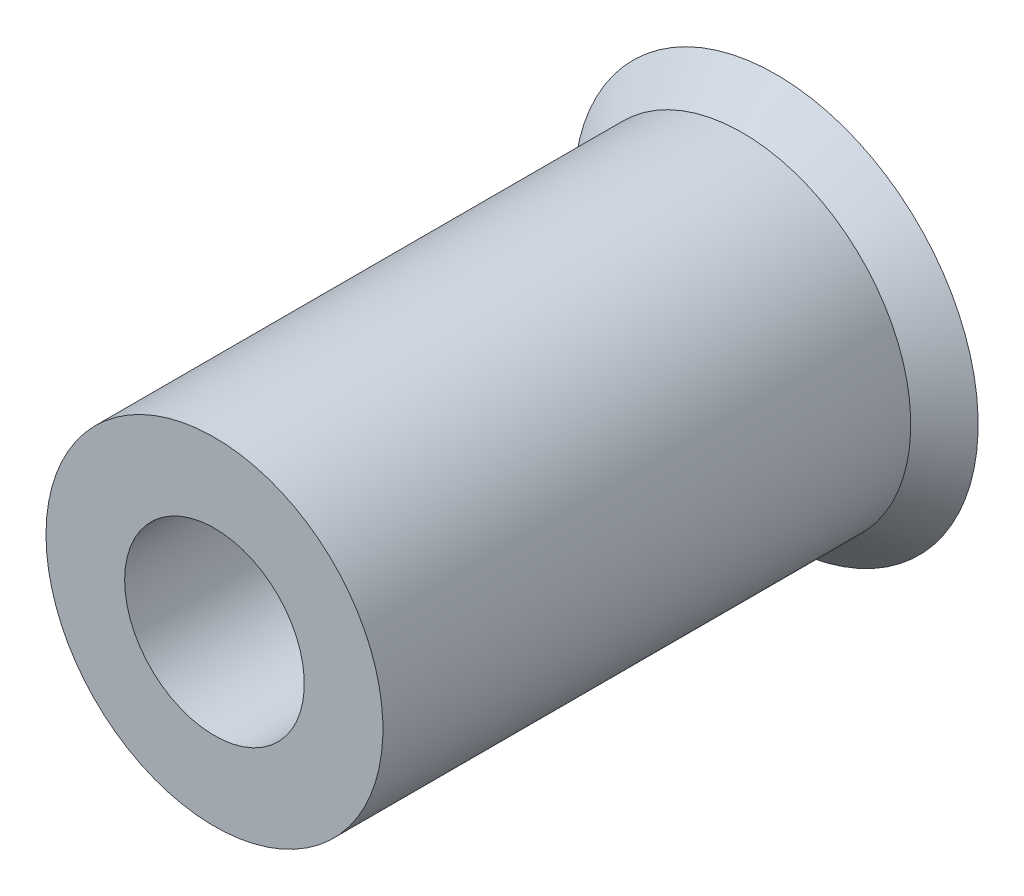
ISO-10303-21;
HEADER;
FILE_DESCRIPTION(('STEP AP214'),'2;1');
FILE_NAME('part.step','',(''),(''),'','','');
FILE_SCHEMA(('AUTOMOTIVE_DESIGN { 1 0 10303 214 1 1 1 1 }'));
ENDSEC;
DATA;
#1=APPLICATION_CONTEXT('core data for automotive mechanical design processes');
#2=APPLICATION_PROTOCOL_DEFINITION('international standard','automotive_design',2000,#1);
#3=PRODUCT_CONTEXT('',#1,'mechanical');
#4=PRODUCT('Part','Part','',(#3));
#5=PRODUCT_RELATED_PRODUCT_CATEGORY('part','',(#4));
#6=PRODUCT_DEFINITION_FORMATION('','',#4);
#7=PRODUCT_DEFINITION_CONTEXT('part definition',#1,'design');
#8=PRODUCT_DEFINITION('design','',#6,#7);
#9=PRODUCT_DEFINITION_SHAPE('','',#8);
#10=(LENGTH_UNIT() NAMED_UNIT(*) SI_UNIT(.MILLI.,.METRE.));
#11=(NAMED_UNIT(*) PLANE_ANGLE_UNIT() SI_UNIT($,.RADIAN.));
#12=(NAMED_UNIT(*) SI_UNIT($,.STERADIAN.) SOLID_ANGLE_UNIT());
#13=UNCERTAINTY_MEASURE_WITH_UNIT(LENGTH_MEASURE(1.E-05),#10,'distance_accuracy_value','');
#14=(GEOMETRIC_REPRESENTATION_CONTEXT(3) GLOBAL_UNCERTAINTY_ASSIGNED_CONTEXT((#13)) GLOBAL_UNIT_ASSIGNED_CONTEXT((#10,
#11,#12)) REPRESENTATION_CONTEXT('',''));
#15=CARTESIAN_POINT('',(0.,0.,0.));
#16=DIRECTION('',(0.,0.,1.));
#17=DIRECTION('',(1.,0.,0.));
#18=AXIS2_PLACEMENT_3D('',#15,#16,#17);
#19=CARTESIAN_POINT('',(0.,3.,10.));
#20=DIRECTION('',(0.,0.,1.));
#21=DIRECTION('',(1.,0.,0.));
#22=AXIS2_PLACEMENT_3D('',#19,#20,#21);
#23=PLANE('',#22);
#24=CARTESIAN_POINT('',(0.,0.,10.));
#25=DIRECTION('',(0.,0.,-1.));
#26=DIRECTION('',(-1.,0.,0.));
#27=AXIS2_PLACEMENT_3D('',#24,#25,#26);
#28=CIRCLE('',#27,1.6);
#29=CARTESIAN_POINT('',(-1.6,0.,10.));
#30=VERTEX_POINT('',#29);
#31=EDGE_CURVE('E10',#30,#30,#28,.T.);
#32=ORIENTED_EDGE('',*,*,#31,.T.);
#33=EDGE_LOOP('',(#32));
#34=FACE_BOUND('',#33,.T.);
#35=CARTESIAN_POINT('',(0.,0.,10.));
#36=DIRECTION('',(0.,0.,-1.));
#37=DIRECTION('',(-1.,0.,0.));
#38=AXIS2_PLACEMENT_3D('',#35,#36,#37);
#39=CIRCLE('',#38,3.);
#40=CARTESIAN_POINT('',(-3.,0.,10.));
#41=VERTEX_POINT('',#40);
#42=EDGE_CURVE('E53',#41,#41,#39,.T.);
#43=ORIENTED_EDGE('',*,*,#42,.F.);
#44=EDGE_LOOP('',(#43));
#45=FACE_BOUND('',#44,.T.);
#46=ADVANCED_FACE('F34',(#34,#45),#23,.T.);
#47=CARTESIAN_POINT('',(0.,0.,0.));
#48=DIRECTION('',(0.,0.,-1.));
#49=DIRECTION('',(-1.,0.,0.));
#50=AXIS2_PLACEMENT_3D('',#47,#48,#49);
#51=CYLINDRICAL_SURFACE('',#50,1.6);
#52=CARTESIAN_POINT('',(0.,0.,0.));
#53=DIRECTION('',(0.,0.,-1.));
#54=DIRECTION('',(-1.,0.,0.));
#55=AXIS2_PLACEMENT_3D('',#52,#53,#54);
#56=CIRCLE('',#55,1.6);
#57=CARTESIAN_POINT('',(-1.6,0.,0.));
#58=VERTEX_POINT('',#57);
#59=EDGE_CURVE('E40',#58,#58,#56,.T.);
#60=ORIENTED_EDGE('',*,*,#59,.T.);
#61=EDGE_LOOP('',(#60));
#62=FACE_BOUND('',#61,.T.);
#63=ORIENTED_EDGE('',*,*,#31,.F.);
#64=EDGE_LOOP('',(#63));
#65=FACE_BOUND('',#64,.T.);
#66=ADVANCED_FACE('F61',(#62,#65),#51,.F.);
#67=CARTESIAN_POINT('',(0.,1.6,0.));
#68=DIRECTION('',(0.,0.,-1.));
#69=DIRECTION('',(-1.,0.,0.));
#70=AXIS2_PLACEMENT_3D('',#67,#68,#69);
#71=PLANE('',#70);
#72=CARTESIAN_POINT('',(0.,0.,0.));
#73=DIRECTION('',(0.,0.,-1.));
#74=DIRECTION('',(-1.,0.,0.));
#75=AXIS2_PLACEMENT_3D('',#72,#73,#74);
#76=CIRCLE('',#75,3.60000000000001);
#77=CARTESIAN_POINT('',(-3.60000000000001,0.,0.));
#78=VERTEX_POINT('',#77);
#79=EDGE_CURVE('E44',#78,#78,#76,.T.);
#80=ORIENTED_EDGE('',*,*,#79,.T.);
#81=EDGE_LOOP('',(#80));
#82=FACE_BOUND('',#81,.T.);
#83=ORIENTED_EDGE('',*,*,#59,.F.);
#84=EDGE_LOOP('',(#83));
#85=FACE_BOUND('',#84,.T.);
#86=ADVANCED_FACE('F65',(#82,#85),#71,.T.);
#87=CARTESIAN_POINT('',(0.,0.,0.));
#88=DIRECTION('',(0.,0.,-1.));
#89=DIRECTION('',(-1.,0.,0.));
#90=AXIS2_PLACEMENT_3D('',#87,#88,#89);
#91=CONICAL_SURFACE('',#90,3.60000000000001,0.785398163397454);
#92=CARTESIAN_POINT('',(0.,0.,0.6));
#93=DIRECTION('',(0.,0.,-1.));
#94=DIRECTION('',(-1.,0.,0.));
#95=AXIS2_PLACEMENT_3D('',#92,#93,#94);
#96=CIRCLE('',#95,3.);
#97=CARTESIAN_POINT('',(-3.,0.,0.6));
#98=VERTEX_POINT('',#97);
#99=EDGE_CURVE('E48',#98,#98,#96,.T.);
#100=ORIENTED_EDGE('',*,*,#99,.T.);
#101=EDGE_LOOP('',(#100));
#102=FACE_BOUND('',#101,.T.);
#103=ORIENTED_EDGE('',*,*,#79,.F.);
#104=EDGE_LOOP('',(#103));
#105=FACE_BOUND('',#104,.T.);
#106=ADVANCED_FACE('F69',(#102,#105),#91,.T.);
#107=CARTESIAN_POINT('',(0.,0.,0.));
#108=DIRECTION('',(0.,0.,-1.));
#109=DIRECTION('',(-1.,0.,0.));
#110=AXIS2_PLACEMENT_3D('',#107,#108,#109);
#111=CYLINDRICAL_SURFACE('',#110,3.);
#112=ORIENTED_EDGE('',*,*,#42,.T.);
#113=EDGE_LOOP('',(#112));
#114=FACE_BOUND('',#113,.T.);
#115=ORIENTED_EDGE('',*,*,#99,.F.);
#116=EDGE_LOOP('',(#115));
#117=FACE_BOUND('',#116,.T.);
#118=ADVANCED_FACE('F57',(#114,#117),#111,.T.);
#119=CLOSED_SHELL('',(#46,#66,#86,#106,#118));
#120=MANIFOLD_SOLID_BREP('B2',#119);
#121=ADVANCED_BREP_SHAPE_REPRESENTATION('',(#18,#120),#14);
#122=SHAPE_DEFINITION_REPRESENTATION(#9,#121);
ENDSEC;
END-ISO-10303-21;
